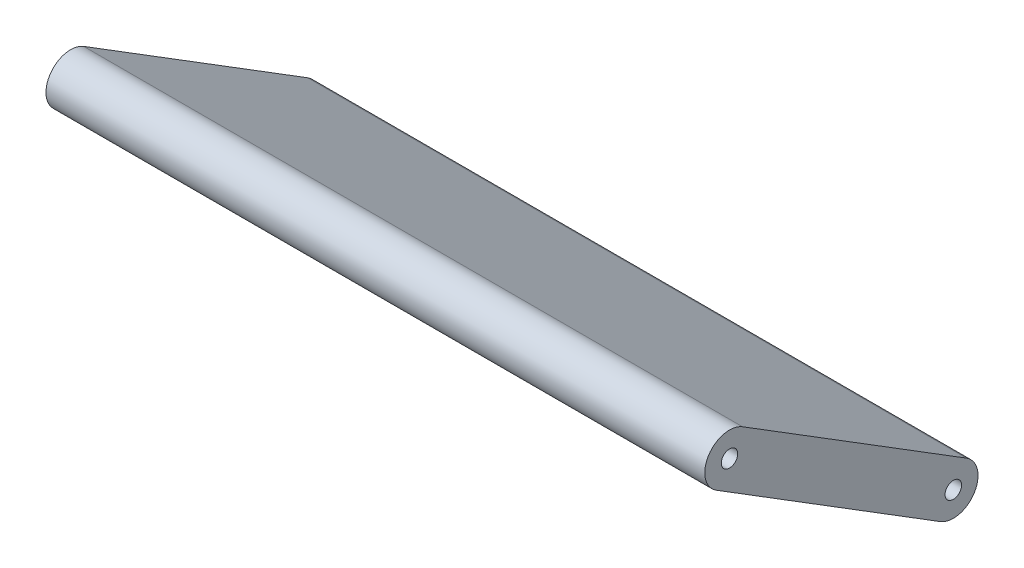
ISO-10303-21;
HEADER;
FILE_DESCRIPTION(('STEP AP214'),'2;1');
FILE_NAME('part.step','',(''),(''),'','','');
FILE_SCHEMA(('AUTOMOTIVE_DESIGN { 1 0 10303 214 1 1 1 1 }'));
ENDSEC;
DATA;
#1=APPLICATION_CONTEXT('core data for automotive mechanical design processes');
#2=APPLICATION_PROTOCOL_DEFINITION('international standard','automotive_design',2000,#1);
#3=PRODUCT_CONTEXT('',#1,'mechanical');
#4=PRODUCT('Part','Part','',(#3));
#5=PRODUCT_RELATED_PRODUCT_CATEGORY('part','',(#4));
#6=PRODUCT_DEFINITION_FORMATION('','',#4);
#7=PRODUCT_DEFINITION_CONTEXT('part definition',#1,'design');
#8=PRODUCT_DEFINITION('design','',#6,#7);
#9=PRODUCT_DEFINITION_SHAPE('','',#8);
#10=(LENGTH_UNIT() NAMED_UNIT(*) SI_UNIT(.MILLI.,.METRE.));
#11=(NAMED_UNIT(*) PLANE_ANGLE_UNIT() SI_UNIT($,.RADIAN.));
#12=(NAMED_UNIT(*) SI_UNIT($,.STERADIAN.) SOLID_ANGLE_UNIT());
#13=UNCERTAINTY_MEASURE_WITH_UNIT(LENGTH_MEASURE(1.E-05),#10,'distance_accuracy_value','');
#14=(GEOMETRIC_REPRESENTATION_CONTEXT(3) GLOBAL_UNCERTAINTY_ASSIGNED_CONTEXT((#13)) GLOBAL_UNIT_ASSIGNED_CONTEXT((#10,
#11,#12)) REPRESENTATION_CONTEXT('',''));
#15=CARTESIAN_POINT('',(0.,0.,0.));
#16=DIRECTION('',(0.,0.,1.));
#17=DIRECTION('',(1.,0.,0.));
#18=AXIS2_PLACEMENT_3D('',#15,#16,#17);
#19=CARTESIAN_POINT('',(10.,-3.35597814616778,5.7968006269233));
#20=DIRECTION('',(1.,0.,0.));
#21=DIRECTION('',(0.,0.,-1.));
#22=AXIS2_PLACEMENT_3D('',#19,#20,#21);
#23=PLANE('',#22);
#24=CARTESIAN_POINT('',(10.,-5.4669065046789,2.39915711042049));
#25=DIRECTION('',(1.,0.,0.));
#26=DIRECTION('',(0.,0.,-1.));
#27=AXIS2_PLACEMENT_3D('',#24,#25,#26);
#28=CIRCLE('',#27,0.125);
#29=CARTESIAN_POINT('',(10.,-5.4669065046789,2.27415711042049));
#30=VERTEX_POINT('',#29);
#31=EDGE_CURVE('E100',#30,#30,#28,.T.);
#32=ORIENTED_EDGE('',*,*,#31,.F.);
#33=EDGE_LOOP('',(#32));
#34=FACE_BOUND('',#33,.T.);
#35=CARTESIAN_POINT('',(10.,-3.35597814616778,5.7968006269233));
#36=DIRECTION('',(1.,0.,0.));
#37=DIRECTION('',(0.,0.,-1.));
#38=AXIS2_PLACEMENT_3D('',#35,#36,#37);
#39=CIRCLE('',#38,0.375);
#40=CARTESIAN_POINT('',(10.,-3.03744906649564,5.59890109331288));
#41=VERTEX_POINT('',#40);
#42=CARTESIAN_POINT('',(10.,-3.67450722583992,5.99470016053371));
#43=VERTEX_POINT('',#42);
#44=EDGE_CURVE('E85',#41,#43,#39,.T.);
#45=ORIENTED_EDGE('',*,*,#44,.T.);
#46=DIRECTION('',(0.,-0.527732089627779,-0.849410879125702));
#47=VECTOR('',#46,1.);
#48=CARTESIAN_POINT('',(10.,-3.67450722583992,5.99470016053371));
#49=LINE('',#48,#47);
#50=CARTESIAN_POINT('',(10.,-5.78543558435103,2.59705664403091));
#51=VERTEX_POINT('',#50);
#52=EDGE_CURVE('E80',#43,#51,#49,.T.);
#53=ORIENTED_EDGE('',*,*,#52,.T.);
#54=CARTESIAN_POINT('',(10.,-5.4669065046789,2.39915711042049));
#55=DIRECTION('',(1.,0.,0.));
#56=DIRECTION('',(0.,0.,-1.));
#57=AXIS2_PLACEMENT_3D('',#54,#55,#56);
#58=CIRCLE('',#57,0.374999999999999);
#59=CARTESIAN_POINT('',(10.,-5.14837742500676,2.20125757681007));
#60=VERTEX_POINT('',#59);
#61=EDGE_CURVE('E83',#51,#60,#58,.T.);
#62=ORIENTED_EDGE('',*,*,#61,.T.);
#63=DIRECTION('',(0.,0.527732089627779,0.849410879125702));
#64=VECTOR('',#63,1.);
#65=CARTESIAN_POINT('',(10.,-3.03744906649564,5.59890109331288));
#66=LINE('',#65,#64);
#67=EDGE_CURVE('E50',#60,#41,#66,.T.);
#68=ORIENTED_EDGE('',*,*,#67,.T.);
#69=EDGE_LOOP('',(#45,#53,#62,#68));
#70=FACE_BOUND('',#69,.T.);
#71=CARTESIAN_POINT('',(10.,-3.35597814616778,5.7968006269233));
#72=DIRECTION('',(1.,0.,0.));
#73=DIRECTION('',(0.,0.,-1.));
#74=AXIS2_PLACEMENT_3D('',#71,#72,#73);
#75=CIRCLE('',#74,0.125);
#76=CARTESIAN_POINT('',(10.,-3.35597814616778,5.6718006269233));
#77=VERTEX_POINT('',#76);
#78=EDGE_CURVE('E115',#77,#77,#75,.T.);
#79=ORIENTED_EDGE('',*,*,#78,.F.);
#80=EDGE_LOOP('',(#79));
#81=FACE_BOUND('',#80,.T.);
#82=ADVANCED_FACE('F33',(#34,#70,#81),#23,.T.);
#83=CARTESIAN_POINT('',(0.,-3.35597814616778,5.7968006269233));
#84=DIRECTION('',(1.,0.,0.));
#85=DIRECTION('',(0.,0.,-1.));
#86=AXIS2_PLACEMENT_3D('',#83,#84,#85);
#87=PLANE('',#86);
#88=CARTESIAN_POINT('',(0.,-3.35597814616778,5.7968006269233));
#89=DIRECTION('',(1.,0.,0.));
#90=DIRECTION('',(0.,0.,-1.));
#91=AXIS2_PLACEMENT_3D('',#88,#89,#90);
#92=CIRCLE('',#91,0.375);
#93=CARTESIAN_POINT('',(0.,-3.03744906649564,5.59890109331288));
#94=VERTEX_POINT('',#93);
#95=CARTESIAN_POINT('',(0.,-3.67450722583992,5.99470016053371));
#96=VERTEX_POINT('',#95);
#97=EDGE_CURVE('E97',#94,#96,#92,.T.);
#98=ORIENTED_EDGE('',*,*,#97,.F.);
#99=DIRECTION('',(0.,0.527732089627779,0.849410879125702));
#100=VECTOR('',#99,1.);
#101=CARTESIAN_POINT('',(0.,-3.03744906649564,5.59890109331288));
#102=LINE('',#101,#100);
#103=CARTESIAN_POINT('',(0.,-5.14837742500676,2.20125757681007));
#104=VERTEX_POINT('',#103);
#105=EDGE_CURVE('E73',#104,#94,#102,.T.);
#106=ORIENTED_EDGE('',*,*,#105,.F.);
#107=CARTESIAN_POINT('',(0.,-5.4669065046789,2.39915711042049));
#108=DIRECTION('',(1.,0.,0.));
#109=DIRECTION('',(0.,0.,-1.));
#110=AXIS2_PLACEMENT_3D('',#107,#108,#109);
#111=CIRCLE('',#110,0.374999999999999);
#112=CARTESIAN_POINT('',(0.,-5.78543558435103,2.59705664403091));
#113=VERTEX_POINT('',#112);
#114=EDGE_CURVE('E67',#113,#104,#111,.T.);
#115=ORIENTED_EDGE('',*,*,#114,.F.);
#116=DIRECTION('',(0.,-0.527732089627779,-0.849410879125702));
#117=VECTOR('',#116,1.);
#118=CARTESIAN_POINT('',(0.,-3.67450722583992,5.99470016053371));
#119=LINE('',#118,#117);
#120=EDGE_CURVE('E89',#96,#113,#119,.T.);
#121=ORIENTED_EDGE('',*,*,#120,.F.);
#122=EDGE_LOOP('',(#98,#106,#115,#121));
#123=FACE_BOUND('',#122,.T.);
#124=CARTESIAN_POINT('',(0.,-5.4669065046789,2.39915711042049));
#125=DIRECTION('',(1.,0.,0.));
#126=DIRECTION('',(0.,0.,-1.));
#127=AXIS2_PLACEMENT_3D('',#124,#125,#126);
#128=CIRCLE('',#127,0.125);
#129=CARTESIAN_POINT('',(0.,-5.4669065046789,2.27415711042049));
#130=VERTEX_POINT('',#129);
#131=EDGE_CURVE('E112',#130,#130,#128,.T.);
#132=ORIENTED_EDGE('',*,*,#131,.T.);
#133=EDGE_LOOP('',(#132));
#134=FACE_BOUND('',#133,.T.);
#135=CARTESIAN_POINT('',(0.,-3.35597814616778,5.7968006269233));
#136=DIRECTION('',(1.,0.,0.));
#137=DIRECTION('',(0.,0.,-1.));
#138=AXIS2_PLACEMENT_3D('',#135,#136,#137);
#139=CIRCLE('',#138,0.125);
#140=CARTESIAN_POINT('',(0.,-3.35597814616778,5.6718006269233));
#141=VERTEX_POINT('',#140);
#142=EDGE_CURVE('E118',#141,#141,#139,.T.);
#143=ORIENTED_EDGE('',*,*,#142,.T.);
#144=EDGE_LOOP('',(#143));
#145=FACE_BOUND('',#144,.T.);
#146=ADVANCED_FACE('F108',(#123,#134,#145),#87,.F.);
#147=CARTESIAN_POINT('',(10.,-3.35597814616778,5.7968006269233));
#148=DIRECTION('',(-1.,0.,0.));
#149=DIRECTION('',(0.,0.,1.));
#150=AXIS2_PLACEMENT_3D('',#147,#148,#149);
#151=CYLINDRICAL_SURFACE('',#150,0.375);
#152=ORIENTED_EDGE('',*,*,#97,.T.);
#153=DIRECTION('',(-1.,0.,0.));
#154=VECTOR('',#153,1.);
#155=CARTESIAN_POINT('',(10.,-3.67450722583992,5.99470016053371));
#156=LINE('',#155,#154);
#157=EDGE_CURVE('E11',#43,#96,#156,.T.);
#158=ORIENTED_EDGE('',*,*,#157,.F.);
#159=ORIENTED_EDGE('',*,*,#44,.F.);
#160=DIRECTION('',(-1.,0.,0.));
#161=VECTOR('',#160,1.);
#162=CARTESIAN_POINT('',(10.,-3.03744906649564,5.59890109331288));
#163=LINE('',#162,#161);
#164=EDGE_CURVE('E93',#41,#94,#163,.T.);
#165=ORIENTED_EDGE('',*,*,#164,.T.);
#166=EDGE_LOOP('',(#152,#158,#159,#165));
#167=FACE_BOUND('',#166,.T.);
#168=ADVANCED_FACE('F35',(#167),#151,.T.);
#169=CARTESIAN_POINT('',(10.,-3.67450722583992,5.99470016053371));
#170=DIRECTION('',(0.,0.849410879125702,-0.527732089627778));
#171=DIRECTION('',(0.,0.527732089627779,0.849410879125702));
#172=AXIS2_PLACEMENT_3D('',#169,#170,#171);
#173=PLANE('',#172);
#174=ORIENTED_EDGE('',*,*,#120,.T.);
#175=DIRECTION('',(-1.,0.,0.));
#176=VECTOR('',#175,1.);
#177=CARTESIAN_POINT('',(10.,-5.78543558435103,2.59705664403091));
#178=LINE('',#177,#176);
#179=EDGE_CURVE('E42',#51,#113,#178,.T.);
#180=ORIENTED_EDGE('',*,*,#179,.F.);
#181=ORIENTED_EDGE('',*,*,#52,.F.);
#182=ORIENTED_EDGE('',*,*,#157,.T.);
#183=EDGE_LOOP('',(#174,#180,#181,#182));
#184=FACE_BOUND('',#183,.T.);
#185=ADVANCED_FACE('F88',(#184),#173,.F.);
#186=CARTESIAN_POINT('',(10.,-5.4669065046789,2.39915711042049));
#187=DIRECTION('',(-1.,0.,0.));
#188=DIRECTION('',(0.,0.,1.));
#189=AXIS2_PLACEMENT_3D('',#186,#187,#188);
#190=CYLINDRICAL_SURFACE('',#189,0.374999999999999);
#191=ORIENTED_EDGE('',*,*,#114,.T.);
#192=DIRECTION('',(-1.,0.,0.));
#193=VECTOR('',#192,1.);
#194=CARTESIAN_POINT('',(10.,-5.14837742500676,2.20125757681007));
#195=LINE('',#194,#193);
#196=EDGE_CURVE('E90',#60,#104,#195,.T.);
#197=ORIENTED_EDGE('',*,*,#196,.F.);
#198=ORIENTED_EDGE('',*,*,#61,.F.);
#199=ORIENTED_EDGE('',*,*,#179,.T.);
#200=EDGE_LOOP('',(#191,#197,#198,#199));
#201=FACE_BOUND('',#200,.T.);
#202=ADVANCED_FACE('F91',(#201),#190,.T.);
#203=CARTESIAN_POINT('',(10.,-3.03744906649564,5.59890109331288));
#204=DIRECTION('',(0.,-0.849410879125702,0.527732089627779));
#205=DIRECTION('',(0.,-0.527732089627779,-0.849410879125702));
#206=AXIS2_PLACEMENT_3D('',#203,#204,#205);
#207=PLANE('',#206);
#208=ORIENTED_EDGE('',*,*,#105,.T.);
#209=ORIENTED_EDGE('',*,*,#164,.F.);
#210=ORIENTED_EDGE('',*,*,#67,.F.);
#211=ORIENTED_EDGE('',*,*,#196,.T.);
#212=EDGE_LOOP('',(#208,#209,#210,#211));
#213=FACE_BOUND('',#212,.T.);
#214=ADVANCED_FACE('F105',(#213),#207,.F.);
#215=CARTESIAN_POINT('',(10.,-5.4669065046789,2.39915711042049));
#216=DIRECTION('',(-1.,0.,0.));
#217=DIRECTION('',(0.,0.,1.));
#218=AXIS2_PLACEMENT_3D('',#215,#216,#217);
#219=CYLINDRICAL_SURFACE('',#218,0.125);
#220=ORIENTED_EDGE('',*,*,#31,.T.);
#221=EDGE_LOOP('',(#220));
#222=FACE_BOUND('',#221,.T.);
#223=ORIENTED_EDGE('',*,*,#131,.F.);
#224=EDGE_LOOP('',(#223));
#225=FACE_BOUND('',#224,.T.);
#226=ADVANCED_FACE('F135',(#222,#225),#219,.F.);
#227=CARTESIAN_POINT('',(10.,-3.35597814616778,5.7968006269233));
#228=DIRECTION('',(-1.,0.,0.));
#229=DIRECTION('',(0.,0.,1.));
#230=AXIS2_PLACEMENT_3D('',#227,#228,#229);
#231=CYLINDRICAL_SURFACE('',#230,0.125);
#232=ORIENTED_EDGE('',*,*,#78,.T.);
#233=EDGE_LOOP('',(#232));
#234=FACE_BOUND('',#233,.T.);
#235=ORIENTED_EDGE('',*,*,#142,.F.);
#236=EDGE_LOOP('',(#235));
#237=FACE_BOUND('',#236,.T.);
#238=ADVANCED_FACE('F124',(#234,#237),#231,.F.);
#239=CLOSED_SHELL('',(#82,#146,#168,#185,#202,#214,#226,#238));
#240=MANIFOLD_SOLID_BREP('B2',#239);
#241=ADVANCED_BREP_SHAPE_REPRESENTATION('',(#18,#240),#14);
#242=SHAPE_DEFINITION_REPRESENTATION(#9,#241);
ENDSEC;
END-ISO-10303-21;
